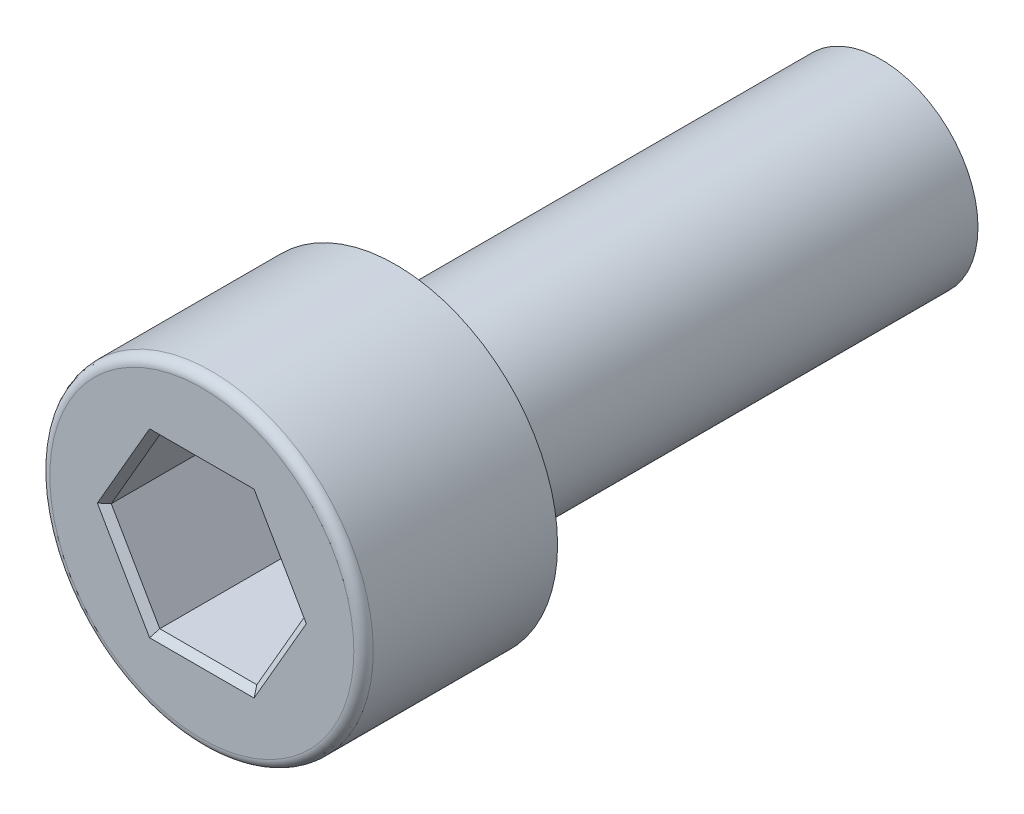
ISO-10303-21;
HEADER;
FILE_DESCRIPTION(('STEP AP214'),'2;1');
FILE_NAME('part.step','',(''),(''),'','','');
FILE_SCHEMA(('AUTOMOTIVE_DESIGN { 1 0 10303 214 1 1 1 1 }'));
ENDSEC;
DATA;
#1=APPLICATION_CONTEXT('core data for automotive mechanical design processes');
#2=APPLICATION_PROTOCOL_DEFINITION('international standard','automotive_design',2000,#1);
#3=PRODUCT_CONTEXT('',#1,'mechanical');
#4=PRODUCT('Part','Part','',(#3));
#5=PRODUCT_RELATED_PRODUCT_CATEGORY('part','',(#4));
#6=PRODUCT_DEFINITION_FORMATION('','',#4);
#7=PRODUCT_DEFINITION_CONTEXT('part definition',#1,'design');
#8=PRODUCT_DEFINITION('design','',#6,#7);
#9=PRODUCT_DEFINITION_SHAPE('','',#8);
#10=(LENGTH_UNIT() NAMED_UNIT(*) SI_UNIT(.MILLI.,.METRE.));
#11=(NAMED_UNIT(*) PLANE_ANGLE_UNIT() SI_UNIT($,.RADIAN.));
#12=(NAMED_UNIT(*) SI_UNIT($,.STERADIAN.) SOLID_ANGLE_UNIT());
#13=UNCERTAINTY_MEASURE_WITH_UNIT(LENGTH_MEASURE(1.E-05),#10,'distance_accuracy_value','');
#14=(GEOMETRIC_REPRESENTATION_CONTEXT(3) GLOBAL_UNCERTAINTY_ASSIGNED_CONTEXT((#13)) GLOBAL_UNIT_ASSIGNED_CONTEXT((#10,
#11,#12)) REPRESENTATION_CONTEXT('',''));
#15=CARTESIAN_POINT('',(0.,0.,0.));
#16=DIRECTION('',(0.,0.,1.));
#17=DIRECTION('',(1.,0.,0.));
#18=AXIS2_PLACEMENT_3D('',#15,#16,#17);
#19=CARTESIAN_POINT('',(0.,0.,21.));
#20=DIRECTION('',(0.,0.,1.));
#21=DIRECTION('',(1.,0.,0.));
#22=AXIS2_PLACEMENT_3D('',#19,#20,#21);
#23=PLANE('',#22);
#24=CARTESIAN_POINT('',(0.,0.,21.));
#25=DIRECTION('',(0.,0.,1.));
#26=DIRECTION('',(1.,0.,0.));
#27=AXIS2_PLACEMENT_3D('',#24,#25,#26);
#28=CIRCLE('',#27,4.7);
#29=CARTESIAN_POINT('',(4.7,0.,21.));
#30=VERTEX_POINT('',#29);
#31=EDGE_CURVE('E41',#30,#30,#28,.T.);
#32=ORIENTED_EDGE('',*,*,#31,.T.);
#33=EDGE_LOOP('',(#32));
#34=FACE_BOUND('',#33,.T.);
#35=DIRECTION('',(-0.49998194741444,0.8660358261987,0.));
#36=VECTOR('',#35,1.);
#37=CARTESIAN_POINT('',(-2.42326132201874,-1.39900322622339,21.));
#38=LINE('',#37,#36);
#39=CARTESIAN_POINT('',(-1.61558114677328,-2.798013673481,21.));
#40=VERTEX_POINT('',#39);
#41=CARTESIAN_POINT('',(-3.23093732839883,0.,21.));
#42=VERTEX_POINT('',#41);
#43=EDGE_CURVE('E160',#40,#42,#38,.T.);
#44=ORIENTED_EDGE('',*,*,#43,.T.);
#45=DIRECTION('',(0.499981947414435,0.866035826198702,0.));
#46=VECTOR('',#45,1.);
#47=CARTESIAN_POINT('',(-2.42326132201875,1.39900322622338,21.));
#48=LINE('',#47,#46);
#49=CARTESIAN_POINT('',(-1.61558114677331,2.79801367348098,21.));
#50=VERTEX_POINT('',#49);
#51=EDGE_CURVE('E170',#42,#50,#48,.T.);
#52=ORIENTED_EDGE('',*,*,#51,.T.);
#53=DIRECTION('',(1.,0.,0.));
#54=VECTOR('',#53,1.);
#55=CARTESIAN_POINT('',(0.,2.79801367348098,21.));
#56=LINE('',#55,#54);
#57=CARTESIAN_POINT('',(1.61558114677331,2.79801367348098,21.));
#58=VERTEX_POINT('',#57);
#59=EDGE_CURVE('E168',#50,#58,#56,.T.);
#60=ORIENTED_EDGE('',*,*,#59,.T.);
#61=DIRECTION('',(0.499981947414435,-0.866035826198702,0.));
#62=VECTOR('',#61,1.);
#63=CARTESIAN_POINT('',(2.42326132201875,1.39900322622338,21.));
#64=LINE('',#63,#62);
#65=CARTESIAN_POINT('',(3.23093732839883,0.,21.));
#66=VERTEX_POINT('',#65);
#67=EDGE_CURVE('E166',#58,#66,#64,.T.);
#68=ORIENTED_EDGE('',*,*,#67,.T.);
#69=DIRECTION('',(-0.499981947414435,-0.866035826198702,0.));
#70=VECTOR('',#69,1.);
#71=CARTESIAN_POINT('',(2.42326132201875,-1.39900322622338,21.));
#72=LINE('',#71,#70);
#73=CARTESIAN_POINT('',(1.61558114677331,-2.79801367348098,21.));
#74=VERTEX_POINT('',#73);
#75=EDGE_CURVE('E164',#66,#74,#72,.T.);
#76=ORIENTED_EDGE('',*,*,#75,.T.);
#77=DIRECTION('',(-1.,0.,0.));
#78=VECTOR('',#77,1.);
#79=CARTESIAN_POINT('',(0.,-2.79801367348099,21.));
#80=LINE('',#79,#78);
#81=EDGE_CURVE('E162',#74,#40,#80,.T.);
#82=ORIENTED_EDGE('',*,*,#81,.T.);
#83=EDGE_LOOP('',(#44,#52,#60,#68,#76,#82));
#84=FACE_BOUND('',#83,.T.);
#85=ADVANCED_FACE('F33',(#34,#84),#23,.T.);
#86=CARTESIAN_POINT('',(0.,0.,15.));
#87=DIRECTION('',(0.,0.,-1.));
#88=DIRECTION('',(-1.,0.,0.));
#89=AXIS2_PLACEMENT_3D('',#86,#87,#88);
#90=CYLINDRICAL_SURFACE('',#89,3.);
#91=CARTESIAN_POINT('',(0.,0.,15.));
#92=DIRECTION('',(0.,0.,1.));
#93=DIRECTION('',(1.,0.,0.));
#94=AXIS2_PLACEMENT_3D('',#91,#92,#93);
#95=CIRCLE('',#94,3.);
#96=CARTESIAN_POINT('',(3.,0.,15.));
#97=VERTEX_POINT('',#96);
#98=EDGE_CURVE('E157',#97,#97,#95,.T.);
#99=ORIENTED_EDGE('',*,*,#98,.F.);
#100=EDGE_LOOP('',(#99));
#101=FACE_BOUND('',#100,.T.);
#102=CARTESIAN_POINT('',(0.,0.,0.));
#103=DIRECTION('',(0.,0.,1.));
#104=DIRECTION('',(1.,0.,0.));
#105=AXIS2_PLACEMENT_3D('',#102,#103,#104);
#106=CIRCLE('',#105,3.);
#107=CARTESIAN_POINT('',(3.,0.,0.));
#108=VERTEX_POINT('',#107);
#109=EDGE_CURVE('E154',#108,#108,#106,.T.);
#110=ORIENTED_EDGE('',*,*,#109,.T.);
#111=EDGE_LOOP('',(#110));
#112=FACE_BOUND('',#111,.T.);
#113=ADVANCED_FACE('F35',(#101,#112),#90,.T.);
#114=CARTESIAN_POINT('',(0.,0.,0.));
#115=DIRECTION('',(0.,0.,1.));
#116=DIRECTION('',(1.,0.,0.));
#117=AXIS2_PLACEMENT_3D('',#114,#115,#116);
#118=PLANE('',#117);
#119=ORIENTED_EDGE('',*,*,#109,.F.);
#120=EDGE_LOOP('',(#119));
#121=FACE_BOUND('',#120,.T.);
#122=ADVANCED_FACE('F203',(#121),#118,.F.);
#123=CARTESIAN_POINT('',(0.,0.,15.));
#124=DIRECTION('',(0.,0.,1.));
#125=DIRECTION('',(1.,0.,0.));
#126=AXIS2_PLACEMENT_3D('',#123,#124,#125);
#127=PLANE('',#126);
#128=CARTESIAN_POINT('',(0.,0.,15.));
#129=DIRECTION('',(0.,0.,1.));
#130=DIRECTION('',(1.,0.,0.));
#131=AXIS2_PLACEMENT_3D('',#128,#129,#130);
#132=CIRCLE('',#131,5.);
#133=CARTESIAN_POINT('',(5.,0.,15.));
#134=VERTEX_POINT('',#133);
#135=EDGE_CURVE('E114',#134,#134,#132,.T.);
#136=ORIENTED_EDGE('',*,*,#135,.F.);
#137=EDGE_LOOP('',(#136));
#138=FACE_BOUND('',#137,.T.);
#139=ORIENTED_EDGE('',*,*,#98,.T.);
#140=EDGE_LOOP('',(#139));
#141=FACE_BOUND('',#140,.T.);
#142=ADVANCED_FACE('F207',(#138,#141),#127,.F.);
#143=CARTESIAN_POINT('',(0.,0.,21.));
#144=DIRECTION('',(0.,0.,-1.));
#145=DIRECTION('',(-1.,0.,0.));
#146=AXIS2_PLACEMENT_3D('',#143,#144,#145);
#147=CYLINDRICAL_SURFACE('',#146,5.);
#148=CARTESIAN_POINT('',(0.,0.,20.7));
#149=DIRECTION('',(0.,0.,1.));
#150=DIRECTION('',(1.,0.,0.));
#151=AXIS2_PLACEMENT_3D('',#148,#149,#150);
#152=CIRCLE('',#151,5.);
#153=CARTESIAN_POINT('',(5.,0.,20.7));
#154=VERTEX_POINT('',#153);
#155=EDGE_CURVE('E11',#154,#154,#152,.F.);
#156=ORIENTED_EDGE('',*,*,#155,.T.);
#157=EDGE_LOOP('',(#156));
#158=FACE_BOUND('',#157,.T.);
#159=ORIENTED_EDGE('',*,*,#135,.T.);
#160=EDGE_LOOP('',(#159));
#161=FACE_BOUND('',#160,.T.);
#162=ADVANCED_FACE('F209',(#158,#161),#147,.T.);
#163=CARTESIAN_POINT('',(-1.50010831355799,-2.598013673481,17.));
#164=DIRECTION('',(0.8660358261987,0.49998194741444,0.));
#165=DIRECTION('',(-0.49998194741444,0.8660358261987,0.));
#166=AXIS2_PLACEMENT_3D('',#163,#164,#165);
#167=PLANE('',#166);
#168=DIRECTION('',(0.,0.,1.));
#169=VECTOR('',#168,1.);
#170=CARTESIAN_POINT('',(-3.,0.,17.));
#171=LINE('',#170,#169);
#172=CARTESIAN_POINT('',(-3.,0.,17.));
#173=VERTEX_POINT('',#172);
#174=CARTESIAN_POINT('',(-3.,0.,20.8));
#175=VERTEX_POINT('',#174);
#176=EDGE_CURVE('E105',#173,#175,#171,.T.);
#177=ORIENTED_EDGE('',*,*,#176,.T.);
#178=DIRECTION('',(0.49998194741444,-0.8660358261987,0.));
#179=VECTOR('',#178,1.);
#180=CARTESIAN_POINT('',(-1.50010831355799,-2.598013673481,20.8));
#181=LINE('',#180,#179);
#182=CARTESIAN_POINT('',(-1.50010831355799,-2.598013673481,20.8));
#183=VERTEX_POINT('',#182);
#184=EDGE_CURVE('E48',#175,#183,#181,.T.);
#185=ORIENTED_EDGE('',*,*,#184,.T.);
#186=DIRECTION('',(0.,0.,1.));
#187=VECTOR('',#186,1.);
#188=CARTESIAN_POINT('',(-1.50010831355799,-2.598013673481,17.));
#189=LINE('',#188,#187);
#190=CARTESIAN_POINT('',(-1.50010831355799,-2.598013673481,17.));
#191=VERTEX_POINT('',#190);
#192=EDGE_CURVE('E120',#191,#183,#189,.T.);
#193=ORIENTED_EDGE('',*,*,#192,.F.);
#194=DIRECTION('',(-0.49998194741444,0.8660358261987,0.));
#195=VECTOR('',#194,1.);
#196=CARTESIAN_POINT('',(-1.50010831355799,-2.598013673481,17.));
#197=LINE('',#196,#195);
#198=EDGE_CURVE('E118',#191,#173,#197,.T.);
#199=ORIENTED_EDGE('',*,*,#198,.T.);
#200=EDGE_LOOP('',(#177,#185,#193,#199));
#201=FACE_BOUND('',#200,.T.);
#202=ADVANCED_FACE('F119',(#201),#167,.T.);
#203=CARTESIAN_POINT('',(-3.,0.,17.));
#204=DIRECTION('',(0.866035826198702,-0.499981947414435,0.));
#205=DIRECTION('',(0.499981947414435,0.866035826198702,0.));
#206=AXIS2_PLACEMENT_3D('',#203,#204,#205);
#207=PLANE('',#206);
#208=DIRECTION('',(0.,0.,1.));
#209=VECTOR('',#208,1.);
#210=CARTESIAN_POINT('',(-1.50010831355801,2.59801367348098,17.));
#211=LINE('',#210,#209);
#212=CARTESIAN_POINT('',(-1.50010831355801,2.59801367348098,17.));
#213=VERTEX_POINT('',#212);
#214=CARTESIAN_POINT('',(-1.50010831355801,2.59801367348098,20.8));
#215=VERTEX_POINT('',#214);
#216=EDGE_CURVE('E115',#213,#215,#211,.T.);
#217=ORIENTED_EDGE('',*,*,#216,.T.);
#218=DIRECTION('',(-0.499981947414435,-0.866035826198702,0.));
#219=VECTOR('',#218,1.);
#220=CARTESIAN_POINT('',(-3.,0.,20.8));
#221=LINE('',#220,#219);
#222=EDGE_CURVE('E113',#215,#175,#221,.T.);
#223=ORIENTED_EDGE('',*,*,#222,.T.);
#224=ORIENTED_EDGE('',*,*,#176,.F.);
#225=DIRECTION('',(0.499981947414435,0.866035826198702,0.));
#226=VECTOR('',#225,1.);
#227=CARTESIAN_POINT('',(-3.,0.,17.));
#228=LINE('',#227,#226);
#229=EDGE_CURVE('E110',#173,#213,#228,.T.);
#230=ORIENTED_EDGE('',*,*,#229,.T.);
#231=EDGE_LOOP('',(#217,#223,#224,#230));
#232=FACE_BOUND('',#231,.T.);
#233=ADVANCED_FACE('F108',(#232),#207,.T.);
#234=CARTESIAN_POINT('',(-1.50010831355801,2.59801367348098,17.));
#235=DIRECTION('',(0.,-1.,0.));
#236=DIRECTION('',(0.,0.,-1.));
#237=AXIS2_PLACEMENT_3D('',#234,#235,#236);
#238=PLANE('',#237);
#239=DIRECTION('',(0.,0.,1.));
#240=VECTOR('',#239,1.);
#241=CARTESIAN_POINT('',(1.50010831355801,2.59801367348098,17.));
#242=LINE('',#241,#240);
#243=CARTESIAN_POINT('',(1.50010831355801,2.59801367348098,17.));
#244=VERTEX_POINT('',#243);
#245=CARTESIAN_POINT('',(1.50010831355801,2.59801367348098,20.8));
#246=VERTEX_POINT('',#245);
#247=EDGE_CURVE('E148',#244,#246,#242,.T.);
#248=ORIENTED_EDGE('',*,*,#247,.T.);
#249=DIRECTION('',(-1.,0.,0.));
#250=VECTOR('',#249,1.);
#251=CARTESIAN_POINT('',(-1.50010831355801,2.59801367348098,20.8));
#252=LINE('',#251,#250);
#253=EDGE_CURVE('E174',#246,#215,#252,.T.);
#254=ORIENTED_EDGE('',*,*,#253,.T.);
#255=ORIENTED_EDGE('',*,*,#216,.F.);
#256=DIRECTION('',(1.,0.,0.));
#257=VECTOR('',#256,1.);
#258=CARTESIAN_POINT('',(-1.50010831355801,2.59801367348098,17.));
#259=LINE('',#258,#257);
#260=EDGE_CURVE('E129',#213,#244,#259,.T.);
#261=ORIENTED_EDGE('',*,*,#260,.T.);
#262=EDGE_LOOP('',(#248,#254,#255,#261));
#263=FACE_BOUND('',#262,.T.);
#264=ADVANCED_FACE('F242',(#263),#238,.T.);
#265=CARTESIAN_POINT('',(1.50010831355801,2.59801367348098,17.));
#266=DIRECTION('',(-0.866035826198702,-0.499981947414435,0.));
#267=DIRECTION('',(0.499981947414435,-0.866035826198702,0.));
#268=AXIS2_PLACEMENT_3D('',#265,#266,#267);
#269=PLANE('',#268);
#270=DIRECTION('',(0.,0.,1.));
#271=VECTOR('',#270,1.);
#272=CARTESIAN_POINT('',(3.,0.,17.));
#273=LINE('',#272,#271);
#274=CARTESIAN_POINT('',(3.,0.,17.));
#275=VERTEX_POINT('',#274);
#276=CARTESIAN_POINT('',(3.,0.,20.8));
#277=VERTEX_POINT('',#276);
#278=EDGE_CURVE('E145',#275,#277,#273,.T.);
#279=ORIENTED_EDGE('',*,*,#278,.T.);
#280=DIRECTION('',(-0.499981947414435,0.866035826198702,0.));
#281=VECTOR('',#280,1.);
#282=CARTESIAN_POINT('',(1.50010831355801,2.59801367348098,20.8));
#283=LINE('',#282,#281);
#284=EDGE_CURVE('E176',#277,#246,#283,.T.);
#285=ORIENTED_EDGE('',*,*,#284,.T.);
#286=ORIENTED_EDGE('',*,*,#247,.F.);
#287=DIRECTION('',(0.499981947414435,-0.866035826198702,0.));
#288=VECTOR('',#287,1.);
#289=CARTESIAN_POINT('',(1.50010831355801,2.59801367348098,17.));
#290=LINE('',#289,#288);
#291=EDGE_CURVE('E131',#244,#275,#290,.T.);
#292=ORIENTED_EDGE('',*,*,#291,.T.);
#293=EDGE_LOOP('',(#279,#285,#286,#292));
#294=FACE_BOUND('',#293,.T.);
#295=ADVANCED_FACE('F248',(#294),#269,.T.);
#296=CARTESIAN_POINT('',(3.,0.,17.));
#297=DIRECTION('',(-0.866035826198702,0.499981947414435,0.));
#298=DIRECTION('',(-0.499981947414435,-0.866035826198702,0.));
#299=AXIS2_PLACEMENT_3D('',#296,#297,#298);
#300=PLANE('',#299);
#301=DIRECTION('',(0.,0.,1.));
#302=VECTOR('',#301,1.);
#303=CARTESIAN_POINT('',(1.50010831355801,-2.59801367348098,17.));
#304=LINE('',#303,#302);
#305=CARTESIAN_POINT('',(1.50010831355801,-2.59801367348098,17.));
#306=VERTEX_POINT('',#305);
#307=CARTESIAN_POINT('',(1.50010831355801,-2.59801367348098,20.8));
#308=VERTEX_POINT('',#307);
#309=EDGE_CURVE('E143',#306,#308,#304,.T.);
#310=ORIENTED_EDGE('',*,*,#309,.T.);
#311=DIRECTION('',(0.499981947414435,0.866035826198702,0.));
#312=VECTOR('',#311,1.);
#313=CARTESIAN_POINT('',(3.,0.,20.8));
#314=LINE('',#313,#312);
#315=EDGE_CURVE('E178',#308,#277,#314,.T.);
#316=ORIENTED_EDGE('',*,*,#315,.T.);
#317=ORIENTED_EDGE('',*,*,#278,.F.);
#318=DIRECTION('',(-0.499981947414435,-0.866035826198702,0.));
#319=VECTOR('',#318,1.);
#320=CARTESIAN_POINT('',(3.,0.,17.));
#321=LINE('',#320,#319);
#322=EDGE_CURVE('E137',#275,#306,#321,.T.);
#323=ORIENTED_EDGE('',*,*,#322,.T.);
#324=EDGE_LOOP('',(#310,#316,#317,#323));
#325=FACE_BOUND('',#324,.T.);
#326=ADVANCED_FACE('F256',(#325),#300,.T.);
#327=CARTESIAN_POINT('',(1.50010831355801,-2.59801367348098,17.));
#328=DIRECTION('',(0.,1.,0.));
#329=DIRECTION('',(-1.,0.,0.));
#330=AXIS2_PLACEMENT_3D('',#327,#328,#329);
#331=PLANE('',#330);
#332=ORIENTED_EDGE('',*,*,#192,.T.);
#333=DIRECTION('',(1.,0.,0.));
#334=VECTOR('',#333,1.);
#335=CARTESIAN_POINT('',(1.50010831355801,-2.59801367348098,20.8));
#336=LINE('',#335,#334);
#337=EDGE_CURVE('E55',#183,#308,#336,.T.);
#338=ORIENTED_EDGE('',*,*,#337,.T.);
#339=ORIENTED_EDGE('',*,*,#309,.F.);
#340=DIRECTION('',(-1.,0.,0.));
#341=VECTOR('',#340,1.);
#342=CARTESIAN_POINT('',(1.50010831355801,-2.59801367348098,17.));
#343=LINE('',#342,#341);
#344=EDGE_CURVE('E140',#306,#191,#343,.T.);
#345=ORIENTED_EDGE('',*,*,#344,.T.);
#346=EDGE_LOOP('',(#332,#338,#339,#345));
#347=FACE_BOUND('',#346,.T.);
#348=ADVANCED_FACE('F264',(#347),#331,.T.);
#349=CARTESIAN_POINT('',(-1.50010831355799,-2.598013673481,17.));
#350=DIRECTION('',(0.,0.,1.));
#351=DIRECTION('',(1.,0.,0.));
#352=AXIS2_PLACEMENT_3D('',#349,#350,#351);
#353=PLANE('',#352);
#354=ORIENTED_EDGE('',*,*,#198,.F.);
#355=ORIENTED_EDGE('',*,*,#344,.F.);
#356=ORIENTED_EDGE('',*,*,#322,.F.);
#357=ORIENTED_EDGE('',*,*,#291,.F.);
#358=ORIENTED_EDGE('',*,*,#260,.F.);
#359=ORIENTED_EDGE('',*,*,#229,.F.);
#360=EDGE_LOOP('',(#354,#355,#356,#357,#358,#359));
#361=FACE_BOUND('',#360,.T.);
#362=ADVANCED_FACE('F126',(#361),#353,.T.);
#363=CARTESIAN_POINT('',(2.42326132201875,-1.39900322622338,21.));
#364=DIRECTION('',(0.612379805455595,-0.353540625487602,-0.70710678118655));
#365=DIRECTION('',(-0.755925047127014,0.,-0.654658172732932));
#366=AXIS2_PLACEMENT_3D('',#363,#364,#365);
#367=PLANE('',#366);
#368=DIRECTION('',(-0.755925047127014,0.,-0.654658172732932));
#369=VECTOR('',#368,1.);
#370=CARTESIAN_POINT('',(2.76941294278624,0.,20.6003033473952));
#371=LINE('',#370,#369);
#372=EDGE_CURVE('E383',#277,#66,#371,.F.);
#373=ORIENTED_EDGE('',*,*,#372,.F.);
#374=ORIENTED_EDGE('',*,*,#315,.F.);
#375=DIRECTION('',(-0.377972270952998,0.654651419608419,-0.654651419608417));
#376=VECTOR('',#375,1.);
#377=CARTESIAN_POINT('',(1.3847975277864,-2.39829434113097,20.60028066765));
#378=LINE('',#377,#376);
#379=EDGE_CURVE('E124',#74,#308,#378,.T.);
#380=ORIENTED_EDGE('',*,*,#379,.F.);
#381=ORIENTED_EDGE('',*,*,#75,.F.);
#382=EDGE_LOOP('',(#373,#374,#380,#381));
#383=FACE_BOUND('',#382,.T.);
#384=ADVANCED_FACE('F273',(#383),#367,.F.);
#385=CARTESIAN_POINT('',(0.,-2.79801367348099,21.));
#386=DIRECTION('',(0.,-0.707106781186545,-0.70710678118655));
#387=DIRECTION('',(0.,0.70710678118655,-0.707106781186545));
#388=AXIS2_PLACEMENT_3D('',#385,#386,#387);
#389=PLANE('',#388);
#390=ORIENTED_EDGE('',*,*,#379,.T.);
#391=ORIENTED_EDGE('',*,*,#337,.F.);
#392=DIRECTION('',(0.377972270952993,0.654651419608422,-0.654651419608416));
#393=VECTOR('',#392,1.);
#394=CARTESIAN_POINT('',(-1.38477431664083,-2.39825413921527,20.6002404657343));
#395=LINE('',#394,#393);
#396=EDGE_CURVE('E379',#40,#183,#395,.T.);
#397=ORIENTED_EDGE('',*,*,#396,.F.);
#398=ORIENTED_EDGE('',*,*,#81,.F.);
#399=EDGE_LOOP('',(#390,#391,#397,#398));
#400=FACE_BOUND('',#399,.T.);
#401=ADVANCED_FACE('F285',(#400),#389,.F.);
#402=CARTESIAN_POINT('',(2.42326132201875,1.39900322622338,21.));
#403=DIRECTION('',(0.612379805455595,0.353540625487602,-0.70710678118655));
#404=DIRECTION('',(-0.755925047127014,0.,-0.654658172732933));
#405=AXIS2_PLACEMENT_3D('',#402,#403,#404);
#406=PLANE('',#405);
#407=ORIENTED_EDGE('',*,*,#372,.T.);
#408=ORIENTED_EDGE('',*,*,#67,.F.);
#409=DIRECTION('',(-0.377972270952996,-0.654651419608421,-0.654651419608416));
#410=VECTOR('',#409,1.);
#411=CARTESIAN_POINT('',(1.38477431664085,2.39825413921525,20.6002404657343));
#412=LINE('',#411,#410);
#413=EDGE_CURVE('E375',#246,#58,#412,.F.);
#414=ORIENTED_EDGE('',*,*,#413,.F.);
#415=ORIENTED_EDGE('',*,*,#284,.F.);
#416=EDGE_LOOP('',(#407,#408,#414,#415));
#417=FACE_BOUND('',#416,.T.);
#418=ADVANCED_FACE('F293',(#417),#406,.F.);
#419=CARTESIAN_POINT('',(-2.42326132201874,-1.39900322622339,21.));
#420=DIRECTION('',(-0.612379805455592,-0.353540625487605,-0.70710678118655));
#421=DIRECTION('',(-0.755925047127015,0.,0.654658172732931));
#422=AXIS2_PLACEMENT_3D('',#419,#420,#421);
#423=PLANE('',#422);
#424=ORIENTED_EDGE('',*,*,#396,.T.);
#425=ORIENTED_EDGE('',*,*,#184,.F.);
#426=DIRECTION('',(-0.755925047127014,0.,0.654658172732932));
#427=VECTOR('',#426,1.);
#428=CARTESIAN_POINT('',(-2.76941294278624,0.,20.6003033473951));
#429=LINE('',#428,#427);
#430=EDGE_CURVE('E380',#42,#175,#429,.F.);
#431=ORIENTED_EDGE('',*,*,#430,.F.);
#432=ORIENTED_EDGE('',*,*,#43,.F.);
#433=EDGE_LOOP('',(#424,#425,#431,#432));
#434=FACE_BOUND('',#433,.T.);
#435=ADVANCED_FACE('F301',(#434),#423,.F.);
#436=CARTESIAN_POINT('',(0.,2.79801367348098,21.));
#437=DIRECTION('',(0.,0.707106781186545,-0.70710678118655));
#438=DIRECTION('',(0.,0.70710678118655,0.707106781186545));
#439=AXIS2_PLACEMENT_3D('',#436,#437,#438);
#440=PLANE('',#439);
#441=ORIENTED_EDGE('',*,*,#413,.T.);
#442=ORIENTED_EDGE('',*,*,#59,.F.);
#443=DIRECTION('',(0.377972270952995,-0.654651419608421,-0.654651419608417));
#444=VECTOR('',#443,1.);
#445=CARTESIAN_POINT('',(-1.3847975277864,2.39829434113097,20.60028066765));
#446=LINE('',#445,#444);
#447=EDGE_CURVE('E385',#215,#50,#446,.F.);
#448=ORIENTED_EDGE('',*,*,#447,.F.);
#449=ORIENTED_EDGE('',*,*,#253,.F.);
#450=EDGE_LOOP('',(#441,#442,#448,#449));
#451=FACE_BOUND('',#450,.T.);
#452=ADVANCED_FACE('F194',(#451),#440,.F.);
#453=CARTESIAN_POINT('',(-2.42326132201875,1.39900322622338,21.));
#454=DIRECTION('',(-0.612379805455595,0.353540625487602,-0.707106781186549));
#455=DIRECTION('',(-0.755925047127013,0.,0.654658172732933));
#456=AXIS2_PLACEMENT_3D('',#453,#454,#455);
#457=PLANE('',#456);
#458=ORIENTED_EDGE('',*,*,#430,.T.);
#459=ORIENTED_EDGE('',*,*,#222,.F.);
#460=ORIENTED_EDGE('',*,*,#447,.T.);
#461=ORIENTED_EDGE('',*,*,#51,.F.);
#462=EDGE_LOOP('',(#458,#459,#460,#461));
#463=FACE_BOUND('',#462,.T.);
#464=ADVANCED_FACE('F188',(#463),#457,.F.);
#465=CARTESIAN_POINT('',(0.,0.,20.7));
#466=DIRECTION('',(0.,0.,1.));
#467=DIRECTION('',(1.,0.,0.));
#468=AXIS2_PLACEMENT_3D('',#465,#466,#467);
#469=TOROIDAL_SURFACE('',#468,4.7,0.3);
#470=ORIENTED_EDGE('',*,*,#155,.F.);
#471=EDGE_LOOP('',(#470));
#472=FACE_BOUND('',#471,.T.);
#473=ORIENTED_EDGE('',*,*,#31,.F.);
#474=EDGE_LOOP('',(#473));
#475=FACE_BOUND('',#474,.T.);
#476=ADVANCED_FACE('F186',(#472,#475),#469,.T.);
#477=CLOSED_SHELL('',(#85,#113,#122,#142,#162,#202,#233,#264,#295,#326,#348,#362,#384,#401,#418,
#435,#452,#464,#476));
#478=MANIFOLD_SOLID_BREP('B2',#477);
#479=ADVANCED_BREP_SHAPE_REPRESENTATION('',(#18,#478),#14);
#480=SHAPE_DEFINITION_REPRESENTATION(#9,#479);
ENDSEC;
END-ISO-10303-21;
